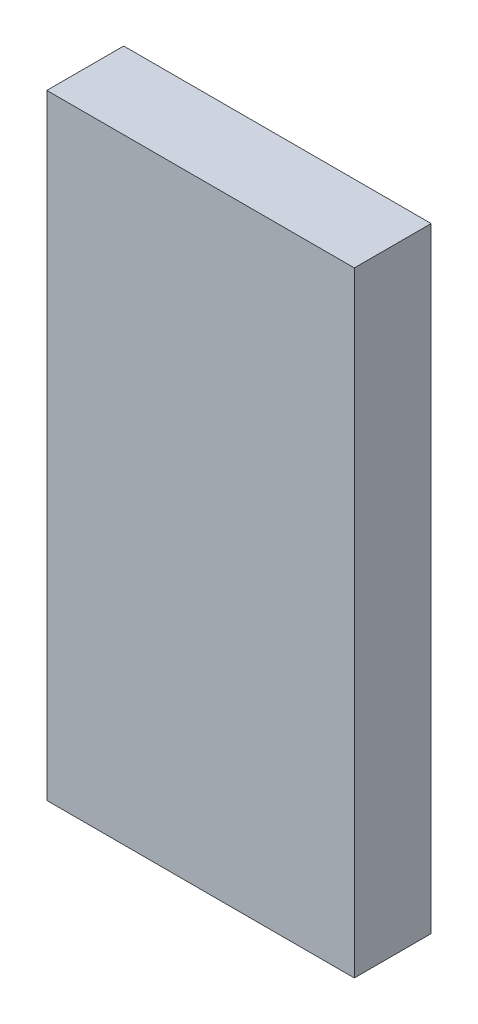
ISO-10303-21;
HEADER;
FILE_DESCRIPTION(('STEP AP214'),'2;1');
FILE_NAME('part.step','',(''),(''),'','','');
FILE_SCHEMA(('AUTOMOTIVE_DESIGN { 1 0 10303 214 1 1 1 1 }'));
ENDSEC;
DATA;
#1=APPLICATION_CONTEXT('core data for automotive mechanical design processes');
#2=APPLICATION_PROTOCOL_DEFINITION('international standard','automotive_design',2000,#1);
#3=PRODUCT_CONTEXT('',#1,'mechanical');
#4=PRODUCT('Part','Part','',(#3));
#5=PRODUCT_RELATED_PRODUCT_CATEGORY('part','',(#4));
#6=PRODUCT_DEFINITION_FORMATION('','',#4);
#7=PRODUCT_DEFINITION_CONTEXT('part definition',#1,'design');
#8=PRODUCT_DEFINITION('design','',#6,#7);
#9=PRODUCT_DEFINITION_SHAPE('','',#8);
#10=(LENGTH_UNIT() NAMED_UNIT(*) SI_UNIT(.MILLI.,.METRE.));
#11=(NAMED_UNIT(*) PLANE_ANGLE_UNIT() SI_UNIT($,.RADIAN.));
#12=(NAMED_UNIT(*) SI_UNIT($,.STERADIAN.) SOLID_ANGLE_UNIT());
#13=UNCERTAINTY_MEASURE_WITH_UNIT(LENGTH_MEASURE(1.E-05),#10,'distance_accuracy_value','');
#14=(GEOMETRIC_REPRESENTATION_CONTEXT(3) GLOBAL_UNCERTAINTY_ASSIGNED_CONTEXT((#13)) GLOBAL_UNIT_ASSIGNED_CONTEXT((#10,
#11,#12)) REPRESENTATION_CONTEXT('',''));
#15=CARTESIAN_POINT('',(0.,0.,0.));
#16=DIRECTION('',(0.,0.,1.));
#17=DIRECTION('',(1.,0.,0.));
#18=AXIS2_PLACEMENT_3D('',#15,#16,#17);
#19=CARTESIAN_POINT('',(0.,0.,3.175));
#20=DIRECTION('',(1.,0.,0.));
#21=DIRECTION('',(0.,1.,0.));
#22=AXIS2_PLACEMENT_3D('',#19,#20,#21);
#23=PLANE('',#22);
#24=DIRECTION('',(0.,-1.,0.));
#25=VECTOR('',#24,1.);
#26=CARTESIAN_POINT('',(0.,0.,0.));
#27=LINE('',#26,#25);
#28=CARTESIAN_POINT('',(0.,25.4,0.));
#29=VERTEX_POINT('',#28);
#30=CARTESIAN_POINT('',(0.,0.,0.));
#31=VERTEX_POINT('',#30);
#32=EDGE_CURVE('E95',#29,#31,#27,.T.);
#33=ORIENTED_EDGE('',*,*,#32,.T.);
#34=DIRECTION('',(0.,0.,-1.));
#35=VECTOR('',#34,1.);
#36=CARTESIAN_POINT('',(0.,0.,3.175));
#37=LINE('',#36,#35);
#38=CARTESIAN_POINT('',(0.,0.,3.175));
#39=VERTEX_POINT('',#38);
#40=EDGE_CURVE('E11',#39,#31,#37,.T.);
#41=ORIENTED_EDGE('',*,*,#40,.F.);
#42=DIRECTION('',(0.,-1.,0.));
#43=VECTOR('',#42,1.);
#44=CARTESIAN_POINT('',(0.,0.,3.175));
#45=LINE('',#44,#43);
#46=CARTESIAN_POINT('',(0.,25.4,3.175));
#47=VERTEX_POINT('',#46);
#48=EDGE_CURVE('E83',#47,#39,#45,.T.);
#49=ORIENTED_EDGE('',*,*,#48,.F.);
#50=DIRECTION('',(0.,0.,-1.));
#51=VECTOR('',#50,1.);
#52=CARTESIAN_POINT('',(0.,25.4,3.175));
#53=LINE('',#52,#51);
#54=EDGE_CURVE('E91',#47,#29,#53,.T.);
#55=ORIENTED_EDGE('',*,*,#54,.T.);
#56=EDGE_LOOP('',(#33,#41,#49,#55));
#57=FACE_BOUND('',#56,.T.);
#58=ADVANCED_FACE('F32',(#57),#23,.F.);
#59=CARTESIAN_POINT('',(0.,0.,3.175));
#60=DIRECTION('',(0.,1.,0.));
#61=DIRECTION('',(0.,0.,1.));
#62=AXIS2_PLACEMENT_3D('',#59,#60,#61);
#63=PLANE('',#62);
#64=DIRECTION('',(1.,0.,0.));
#65=VECTOR('',#64,1.);
#66=CARTESIAN_POINT('',(0.,0.,0.));
#67=LINE('',#66,#65);
#68=CARTESIAN_POINT('',(12.7,0.,0.));
#69=VERTEX_POINT('',#68);
#70=EDGE_CURVE('E87',#31,#69,#67,.T.);
#71=ORIENTED_EDGE('',*,*,#70,.T.);
#72=DIRECTION('',(0.,0.,-1.));
#73=VECTOR('',#72,1.);
#74=CARTESIAN_POINT('',(12.7,0.,3.175));
#75=LINE('',#74,#73);
#76=CARTESIAN_POINT('',(12.7,0.,3.175));
#77=VERTEX_POINT('',#76);
#78=EDGE_CURVE('E40',#77,#69,#75,.T.);
#79=ORIENTED_EDGE('',*,*,#78,.F.);
#80=DIRECTION('',(1.,0.,0.));
#81=VECTOR('',#80,1.);
#82=CARTESIAN_POINT('',(0.,0.,3.175));
#83=LINE('',#82,#81);
#84=EDGE_CURVE('E78',#39,#77,#83,.T.);
#85=ORIENTED_EDGE('',*,*,#84,.F.);
#86=ORIENTED_EDGE('',*,*,#40,.T.);
#87=EDGE_LOOP('',(#71,#79,#85,#86));
#88=FACE_BOUND('',#87,.T.);
#89=ADVANCED_FACE('F86',(#88),#63,.F.);
#90=CARTESIAN_POINT('',(12.7,0.,3.175));
#91=DIRECTION('',(-1.,0.,0.));
#92=DIRECTION('',(0.,-1.,0.));
#93=AXIS2_PLACEMENT_3D('',#90,#91,#92);
#94=PLANE('',#93);
#95=DIRECTION('',(0.,1.,0.));
#96=VECTOR('',#95,1.);
#97=CARTESIAN_POINT('',(12.7,0.,0.));
#98=LINE('',#97,#96);
#99=CARTESIAN_POINT('',(12.7,25.4,0.));
#100=VERTEX_POINT('',#99);
#101=EDGE_CURVE('E65',#69,#100,#98,.T.);
#102=ORIENTED_EDGE('',*,*,#101,.T.);
#103=DIRECTION('',(0.,0.,-1.));
#104=VECTOR('',#103,1.);
#105=CARTESIAN_POINT('',(12.7,25.4,3.175));
#106=LINE('',#105,#104);
#107=CARTESIAN_POINT('',(12.7,25.4,3.175));
#108=VERTEX_POINT('',#107);
#109=EDGE_CURVE('E88',#108,#100,#106,.T.);
#110=ORIENTED_EDGE('',*,*,#109,.F.);
#111=DIRECTION('',(0.,1.,0.));
#112=VECTOR('',#111,1.);
#113=CARTESIAN_POINT('',(12.7,0.,3.175));
#114=LINE('',#113,#112);
#115=EDGE_CURVE('E81',#77,#108,#114,.T.);
#116=ORIENTED_EDGE('',*,*,#115,.F.);
#117=ORIENTED_EDGE('',*,*,#78,.T.);
#118=EDGE_LOOP('',(#102,#110,#116,#117));
#119=FACE_BOUND('',#118,.T.);
#120=ADVANCED_FACE('F89',(#119),#94,.F.);
#121=CARTESIAN_POINT('',(0.,25.4,3.175));
#122=DIRECTION('',(0.,-1.,0.));
#123=DIRECTION('',(0.,0.,-1.));
#124=AXIS2_PLACEMENT_3D('',#121,#122,#123);
#125=PLANE('',#124);
#126=DIRECTION('',(-1.,0.,0.));
#127=VECTOR('',#126,1.);
#128=CARTESIAN_POINT('',(0.,25.4,0.));
#129=LINE('',#128,#127);
#130=EDGE_CURVE('E71',#100,#29,#129,.T.);
#131=ORIENTED_EDGE('',*,*,#130,.T.);
#132=ORIENTED_EDGE('',*,*,#54,.F.);
#133=DIRECTION('',(-1.,0.,0.));
#134=VECTOR('',#133,1.);
#135=CARTESIAN_POINT('',(0.,25.4,3.175));
#136=LINE('',#135,#134);
#137=EDGE_CURVE('E48',#108,#47,#136,.T.);
#138=ORIENTED_EDGE('',*,*,#137,.F.);
#139=ORIENTED_EDGE('',*,*,#109,.T.);
#140=EDGE_LOOP('',(#131,#132,#138,#139));
#141=FACE_BOUND('',#140,.T.);
#142=ADVANCED_FACE('F102',(#141),#125,.F.);
#143=CARTESIAN_POINT('',(0.,0.,3.175));
#144=DIRECTION('',(0.,0.,-1.));
#145=DIRECTION('',(-1.,0.,0.));
#146=AXIS2_PLACEMENT_3D('',#143,#144,#145);
#147=PLANE('',#146);
#148=ORIENTED_EDGE('',*,*,#48,.T.);
#149=ORIENTED_EDGE('',*,*,#84,.T.);
#150=ORIENTED_EDGE('',*,*,#115,.T.);
#151=ORIENTED_EDGE('',*,*,#137,.T.);
#152=EDGE_LOOP('',(#148,#149,#150,#151));
#153=FACE_BOUND('',#152,.T.);
#154=ADVANCED_FACE('F79',(#153),#147,.F.);
#155=CARTESIAN_POINT('',(0.,0.,0.));
#156=DIRECTION('',(0.,0.,-1.));
#157=DIRECTION('',(-1.,0.,0.));
#158=AXIS2_PLACEMENT_3D('',#155,#156,#157);
#159=PLANE('',#158);
#160=ORIENTED_EDGE('',*,*,#32,.F.);
#161=ORIENTED_EDGE('',*,*,#130,.F.);
#162=ORIENTED_EDGE('',*,*,#101,.F.);
#163=ORIENTED_EDGE('',*,*,#70,.F.);
#164=EDGE_LOOP('',(#160,#161,#162,#163));
#165=FACE_BOUND('',#164,.T.);
#166=ADVANCED_FACE('F105',(#165),#159,.T.);
#167=CLOSED_SHELL('',(#58,#89,#120,#142,#154,#166));
#168=MANIFOLD_SOLID_BREP('B2',#167);
#169=ADVANCED_BREP_SHAPE_REPRESENTATION('',(#18,#168),#14);
#170=SHAPE_DEFINITION_REPRESENTATION(#9,#169);
ENDSEC;
END-ISO-10303-21;
